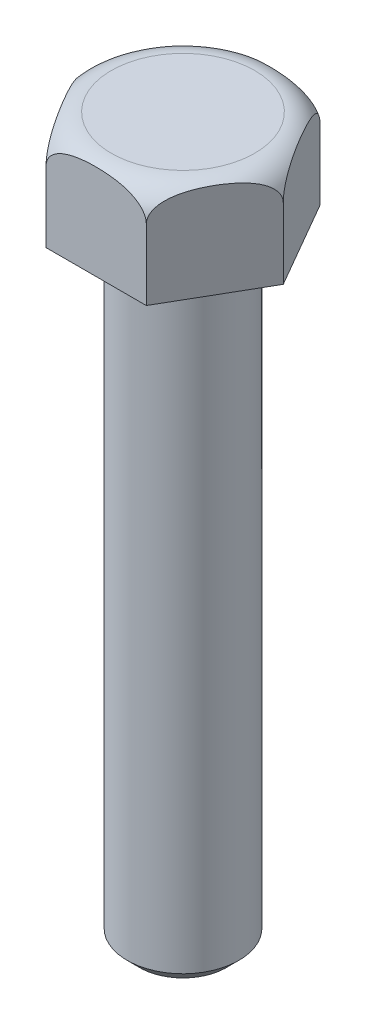
ISO-10303-21;
HEADER;
FILE_DESCRIPTION(('STEP AP214'),'2;1');
FILE_NAME('part.step','',(''),(''),'','','');
FILE_SCHEMA(('AUTOMOTIVE_DESIGN { 1 0 10303 214 1 1 1 1 }'));
ENDSEC;
DATA;
#1=APPLICATION_CONTEXT('core data for automotive mechanical design processes');
#2=APPLICATION_PROTOCOL_DEFINITION('international standard','automotive_design',2000,#1);
#3=PRODUCT_CONTEXT('',#1,'mechanical');
#4=PRODUCT('Part','Part','',(#3));
#5=PRODUCT_RELATED_PRODUCT_CATEGORY('part','',(#4));
#6=PRODUCT_DEFINITION_FORMATION('','',#4);
#7=PRODUCT_DEFINITION_CONTEXT('part definition',#1,'design');
#8=PRODUCT_DEFINITION('design','',#6,#7);
#9=PRODUCT_DEFINITION_SHAPE('','',#8);
#10=(LENGTH_UNIT() NAMED_UNIT(*) SI_UNIT(.MILLI.,.METRE.));
#11=(NAMED_UNIT(*) PLANE_ANGLE_UNIT() SI_UNIT($,.RADIAN.));
#12=(NAMED_UNIT(*) SI_UNIT($,.STERADIAN.) SOLID_ANGLE_UNIT());
#13=UNCERTAINTY_MEASURE_WITH_UNIT(LENGTH_MEASURE(1.E-05),#10,'distance_accuracy_value','');
#14=(GEOMETRIC_REPRESENTATION_CONTEXT(3) GLOBAL_UNCERTAINTY_ASSIGNED_CONTEXT((#13)) GLOBAL_UNIT_ASSIGNED_CONTEXT((#10,
#11,#12)) REPRESENTATION_CONTEXT('',''));
#15=CARTESIAN_POINT('',(0.,0.,0.));
#16=DIRECTION('',(0.,0.,1.));
#17=DIRECTION('',(1.,0.,0.));
#18=AXIS2_PLACEMENT_3D('',#15,#16,#17);
#19=CARTESIAN_POINT('',(2.02072594216373,4.,3.49999999999998));
#20=DIRECTION('',(-0.866025403784441,0.,-0.499999999999995));
#21=DIRECTION('',(-0.499999999999995,0.,0.866025403784442));
#22=AXIS2_PLACEMENT_3D('',#19,#20,#21);
#23=PLANE('',#22);
#24=DIRECTION('',(0.,-1.,0.));
#25=VECTOR('',#24,1.);
#26=CARTESIAN_POINT('',(4.04145188432738,4.,0.));
#27=LINE('',#26,#25);
#28=CARTESIAN_POINT('',(4.04145188432738,2.85,0.));
#29=VERTEX_POINT('',#28);
#30=CARTESIAN_POINT('',(4.04145188432738,0.,0.));
#31=VERTEX_POINT('',#30);
#32=EDGE_CURVE('E128',#29,#31,#27,.T.);
#33=ORIENTED_EDGE('',*,*,#32,.F.);
#34=CARTESIAN_POINT('',(4.04145186693608,2.8498,3.0122621691985E-08));
#35=CARTESIAN_POINT('',(4.04149322142417,2.88380187892288,-7.15979518764948E-05));
#36=CARTESIAN_POINT('',(4.03995806465525,2.91773436665771,0.00258737156948076));
#37=CARTESIAN_POINT('',(4.03403696877717,2.98433902225331,0.0128430104668064));
#38=CARTESIAN_POINT('',(4.02967241562956,3.01701871253889,0.020402638270793));
#39=CARTESIAN_POINT('',(4.01839956153353,3.08045895031124,0.039927794311432));
#40=CARTESIAN_POINT('',(4.01149698940557,3.11122363887679,0.0518833999399569));
#41=CARTESIAN_POINT('',(3.99555166649071,3.17048398695372,0.0795015093715882));
#42=CARTESIAN_POINT('',(3.98650487796236,3.19897522840241,0.0951710067480303));
#43=CARTESIAN_POINT('',(3.96128242026667,3.26824215864386,0.138857584968719));
#44=CARTESIAN_POINT('',(3.94390587637558,3.30726923766369,0.168954641848046));
#45=CARTESIAN_POINT('',(3.90629578057345,3.37935145497597,0.234097238654863));
#46=CARTESIAN_POINT('',(3.88605506551304,3.41239113161981,0.269155185521024));
#47=CARTESIAN_POINT('',(3.83064604955829,3.49165109931031,0.365126416352049));
#48=CARTESIAN_POINT('',(3.79393655609501,3.53352591788705,0.428709124150558));
#49=CARTESIAN_POINT('',(3.71792425190768,3.60602584385068,0.560366297003395));
#50=CARTESIAN_POINT('',(3.67861780313085,3.63663475715325,0.628447063349973));
#51=CARTESIAN_POINT('',(3.59815182063276,3.68944385343092,0.767818233317607));
#52=CARTESIAN_POINT('',(3.55697615149526,3.71154306479972,0.839136584299411));
#53=CARTESIAN_POINT('',(3.47383086822094,3.74883987788691,0.983148439340244));
#54=CARTESIAN_POINT('',(3.43186039734498,3.76402953184749,1.055843427315));
#55=CARTESIAN_POINT('',(3.34722305236247,3.78901681452749,1.20243960904243));
#56=CARTESIAN_POINT('',(3.30455333884125,3.79877476822347,1.27634572080561));
#57=CARTESIAN_POINT('',(3.21901012375083,3.81370913442472,1.42451091558501));
#58=CARTESIAN_POINT('',(3.17613656780916,3.81888424656301,1.49877009277713));
#59=CARTESIAN_POINT('',(3.06955021873615,3.8267520738256,1.68338306476486));
#60=CARTESIAN_POINT('',(3.00579215872111,3.82703190121715,1.79381526410293));
#61=CARTESIAN_POINT('',(2.87828362251635,3.81887355388723,2.01466652720832));
#62=CARTESIAN_POINT('',(2.81453335916186,3.81041995997919,2.12508522233419));
#63=CARTESIAN_POINT('',(2.71970154910687,3.7897270685824,2.28933873552316));
#64=CARTESIAN_POINT('',(2.6883961052263,3.78156160034086,2.3435613548778));
#65=CARTESIAN_POINT('',(2.62603002776021,3.7621286269075,2.45158256971785));
#66=CARTESIAN_POINT('',(2.59496932808908,3.75086199083149,2.50538127966688));
#67=CARTESIAN_POINT('',(2.53332579545366,3.72468659013026,2.61215101014945));
#68=CARTESIAN_POINT('',(2.50274180028232,3.70978895737025,2.66512404368466));
#69=CARTESIAN_POINT('',(2.44220353369672,3.67559863797259,2.76997939721308));
#70=CARTESIAN_POINT('',(2.41224883521509,3.65630904455528,2.82186245690867));
#71=CARTESIAN_POINT('',(2.35637386471924,3.61468453436952,2.91864074467889));
#72=CARTESIAN_POINT('',(2.33035742935453,3.59287312074561,2.9637025325624));
#73=CARTESIAN_POINT('',(2.27948604282456,3.54414446708189,3.05181435868379));
#74=CARTESIAN_POINT('',(2.25463252539055,3.51722112119256,3.09486191362628));
#75=CARTESIAN_POINT('',(2.20654584186762,3.45714160952322,3.17815049265549));
#76=CARTESIAN_POINT('',(2.18332885996643,3.42393267864201,3.21836348490675));
#77=CARTESIAN_POINT('',(2.13978500565841,3.35057373504828,3.29378365292563));
#78=CARTESIAN_POINT('',(2.11945305152026,3.31043621008252,3.32899963051006));
#79=CARTESIAN_POINT('',(2.089069633978,3.2370851957512,3.38162525340083));
#80=CARTESIAN_POINT('',(2.07782437118175,3.20585959787492,3.40110261990841));
#81=CARTESIAN_POINT('',(2.05793752835064,3.14033104450374,3.43554764209402));
#82=CARTESIAN_POINT('',(2.04928806210987,3.10603782935721,3.45052895708138));
#83=CARTESIAN_POINT('',(2.03531139585471,3.03560686955835,3.47473725315576));
#84=CARTESIAN_POINT('',(2.02991843405035,2.99952277105469,3.48407813700419));
#85=CARTESIAN_POINT('',(2.02444061050431,2.94419099021802,3.49356600570084));
#86=CARTESIAN_POINT('',(2.02304962792378,2.92543529463202,3.49597525820274));
#87=CARTESIAN_POINT('',(2.02118908251811,2.88772394417357,3.49919781737515));
#88=CARTESIAN_POINT('',(2.02072042407298,2.86876811134469,3.50000955761353));
#89=CARTESIAN_POINT('',(2.02072595955503,2.8498,3.49999996987736));
#90=B_SPLINE_CURVE_WITH_KNOTS('',3,(#34,#35,#36,#37,#38,#39,#40,#41,#42,#43,#44,#45,#46,#47,#48,
#49,#50,#51,#52,#53,#54,#55,#56,#57,#58,#59,#60,#61,#62,#63,#64,#65,#66,#67,#68,#69,#70,#71,#72,
#73,#74,#75,#76,#77,#78,#79,#80,#81,#82,#83,#84,#85,#86,#87,#88,#89),.UNSPECIFIED.,.F.,.F.,(4,2,
2,2,2,2,2,2,2,2,2,2,2,2,2,2,2,2,2,2,2,2,2,2,2,2,2,4),(0.,0.101754261353979,0.202748242949517,
0.303515646351419,0.404474332416497,0.560353276427938,0.716629192040826,0.968758852911432,
1.22124953303979,1.47665003919534,1.73234358295413,1.98988108277465,2.24749163466334,
2.62975496827881,3.01269435760164,3.20205766445746,3.39136795535976,3.58010500456721,
3.76870953682063,3.93774858454471,4.10699082253584,4.27772242837004,4.44814946923331,
4.56319948836864,4.67789635454159,4.79019200366945,4.84699357104923,4.90385080720723),.UNSPECIFIED.);
#91=CARTESIAN_POINT('',(2.02072594216373,2.85,3.49999999999998));
#92=VERTEX_POINT('',#91);
#93=EDGE_CURVE('E110',#29,#92,#90,.T.);
#94=ORIENTED_EDGE('',*,*,#93,.T.);
#95=DIRECTION('',(0.,-1.,0.));
#96=VECTOR('',#95,1.);
#97=CARTESIAN_POINT('',(2.02072594216373,4.,3.49999999999998));
#98=LINE('',#97,#96);
#99=CARTESIAN_POINT('',(2.02072594216373,0.,3.49999999999998));
#100=VERTEX_POINT('',#99);
#101=EDGE_CURVE('E75',#92,#100,#98,.T.);
#102=ORIENTED_EDGE('',*,*,#101,.T.);
#103=DIRECTION('',(0.499999999999995,0.,-0.866025403784441));
#104=VECTOR('',#103,1.);
#105=CARTESIAN_POINT('',(2.02072594216373,0.,3.49999999999998));
#106=LINE('',#105,#104);
#107=EDGE_CURVE('E149',#100,#31,#106,.T.);
#108=ORIENTED_EDGE('',*,*,#107,.T.);
#109=EDGE_LOOP('',(#33,#94,#102,#108));
#110=FACE_BOUND('',#109,.T.);
#111=ADVANCED_FACE('F51',(#110),#23,.F.);
#112=CARTESIAN_POINT('',(4.04145188432738,4.,0.));
#113=DIRECTION('',(-0.866025403784438,0.,0.500000000000001));
#114=DIRECTION('',(0.500000000000001,0.,0.866025403784438));
#115=AXIS2_PLACEMENT_3D('',#112,#113,#114);
#116=PLANE('',#115);
#117=DIRECTION('',(0.,-1.,0.));
#118=VECTOR('',#117,1.);
#119=CARTESIAN_POINT('',(2.02072594216368,4.,-3.50000000000001));
#120=LINE('',#119,#118);
#121=CARTESIAN_POINT('',(2.02072594216368,2.85,-3.50000000000001));
#122=VERTEX_POINT('',#121);
#123=CARTESIAN_POINT('',(2.02072594216368,0.,-3.50000000000001));
#124=VERTEX_POINT('',#123);
#125=EDGE_CURVE('E119',#122,#124,#120,.T.);
#126=ORIENTED_EDGE('',*,*,#125,.F.);
#127=CARTESIAN_POINT('',(2.02072595955499,2.8498,-3.49999996987738));
#128=CARTESIAN_POINT('',(2.02068460506689,2.88380187892288,-3.50007159795188));
#129=CARTESIAN_POINT('',(2.02221976183582,2.91773436665771,-3.49741262843053));
#130=CARTESIAN_POINT('',(2.0281408577139,2.9843390222533,-3.4871569895332));
#131=CARTESIAN_POINT('',(2.0325054108615,3.01701871253889,-3.47959736172921));
#132=CARTESIAN_POINT('',(2.04377826495754,3.08045895031125,-3.46007220568857));
#133=CARTESIAN_POINT('',(2.05068083708549,3.11122363887679,-3.44811660006005));
#134=CARTESIAN_POINT('',(2.06662616000035,3.17048398695372,-3.42049849062842));
#135=CARTESIAN_POINT('',(2.07567294852871,3.19897522840242,-3.40482899325198));
#136=CARTESIAN_POINT('',(2.1008954062244,3.26824215864386,-3.36114241503129));
#137=CARTESIAN_POINT('',(2.11827195011549,3.30726923766369,-3.33104535815196));
#138=CARTESIAN_POINT('',(2.15588204591762,3.37935145497597,-3.26590276134514));
#139=CARTESIAN_POINT('',(2.17612276097803,3.41239113161981,-3.23084481447898));
#140=CARTESIAN_POINT('',(2.23153177693278,3.49165109931031,-3.13487358364796));
#141=CARTESIAN_POINT('',(2.26824127039606,3.53352591788705,-3.07129087584945));
#142=CARTESIAN_POINT('',(2.34425357458339,3.60602584385068,-2.93963370299661));
#143=CARTESIAN_POINT('',(2.38356002336022,3.63663475715326,-2.87155293665004));
#144=CARTESIAN_POINT('',(2.46402600585831,3.68944385343092,-2.7321817666824));
#145=CARTESIAN_POINT('',(2.50520167499581,3.71154306479972,-2.6608634157006));
#146=CARTESIAN_POINT('',(2.58834695827013,3.74883987788692,-2.51685156065977));
#147=CARTESIAN_POINT('',(2.63031742914609,3.76402953184749,-2.44415657268501));
#148=CARTESIAN_POINT('',(2.7149547741286,3.78901681452749,-2.29756039095758));
#149=CARTESIAN_POINT('',(2.75762448764983,3.79877476822348,-2.2236542791944));
#150=CARTESIAN_POINT('',(2.84316770274025,3.81370913442473,-2.075489084415));
#151=CARTESIAN_POINT('',(2.88604125868191,3.81888424656302,-2.00122990722289));
#152=CARTESIAN_POINT('',(2.99262760775493,3.82675207382561,-1.81661693523515));
#153=CARTESIAN_POINT('',(3.05638566776997,3.82703190121716,-1.70618473589708));
#154=CARTESIAN_POINT('',(3.18389420397474,3.81887355388724,-1.48533347279168));
#155=CARTESIAN_POINT('',(3.24764446732924,3.8104199599792,-1.3749147776658));
#156=CARTESIAN_POINT('',(3.34247627738423,3.78972706858241,-1.21066126447683));
#157=CARTESIAN_POINT('',(3.3737817212648,3.78156160034087,-1.15643864512218));
#158=CARTESIAN_POINT('',(3.43614779873089,3.76212862690751,-1.04841743028214));
#159=CARTESIAN_POINT('',(3.46720849840203,3.7508619908315,-0.9946187203331));
#160=CARTESIAN_POINT('',(3.52885203103745,3.72468659013026,-0.887848989850522));
#161=CARTESIAN_POINT('',(3.55943602620879,3.70978895737025,-0.834875956315315));
#162=CARTESIAN_POINT('',(3.6199742927944,3.67559863797259,-0.730020602786891));
#163=CARTESIAN_POINT('',(3.64992899127603,3.65630904455528,-0.6781375430913));
#164=CARTESIAN_POINT('',(3.70580396177188,3.61468453436952,-0.581359255321073));
#165=CARTESIAN_POINT('',(3.73182039713659,3.59287312074561,-0.536297467437568));
#166=CARTESIAN_POINT('',(3.78269178366656,3.54414446708189,-0.448185641316179));
#167=CARTESIAN_POINT('',(3.80754530110056,3.51722112119256,-0.405138086373692));
#168=CARTESIAN_POINT('',(3.8556319846235,3.45714160952321,-0.321849507344479));
#169=CARTESIAN_POINT('',(3.87884896652468,3.42393267864201,-0.281636515093218));
#170=CARTESIAN_POINT('',(3.92239282083271,3.35057373504827,-0.20621634707434));
#171=CARTESIAN_POINT('',(3.94272477497085,3.31043621008252,-0.171000369489917));
#172=CARTESIAN_POINT('',(3.97310819251311,3.23708519575119,-0.118374746599144));
#173=CARTESIAN_POINT('',(3.98435345530937,3.20585959787491,-0.098897380091565));
#174=CARTESIAN_POINT('',(4.00424029814047,3.14033104450374,-0.0644523579059571));
#175=CARTESIAN_POINT('',(4.01288976438124,3.1060378293572,-0.0494710429185909));
#176=CARTESIAN_POINT('',(4.02686643063641,3.03560686955835,-0.0252627468442127));
#177=CARTESIAN_POINT('',(4.03225939244076,2.99952277105468,-0.0159218629957916));
#178=CARTESIAN_POINT('',(4.03773721598681,2.94419099021802,-0.00643399429914256));
#179=CARTESIAN_POINT('',(4.03912819856733,2.92543529463201,-0.00402474179723443));
#180=CARTESIAN_POINT('',(4.040988743973,2.88772394417357,-0.000802182624827273));
#181=CARTESIAN_POINT('',(4.04145740241814,2.86876811134469,9.55761354566829E-06));
#182=CARTESIAN_POINT('',(4.04145186693608,2.8498,-3.0122621522535E-08));
#183=B_SPLINE_CURVE_WITH_KNOTS('',3,(#127,#128,#129,#130,#131,#132,#133,#134,#135,#136,#137,
#138,#139,#140,#141,#142,#143,#144,#145,#146,#147,#148,#149,#150,#151,#152,#153,#154,#155,#156,
#157,#158,#159,#160,#161,#162,#163,#164,#165,#166,#167,#168,#169,#170,#171,#172,#173,#174,#175,
#176,#177,#178,#179,#180,#181,#182),.UNSPECIFIED.,.F.,.F.,(4,2,2,2,2,2,2,2,2,2,2,2,2,2,2,2,2,2,
2,2,2,2,2,2,2,2,2,4),(0.,0.101754261353979,0.202748242949519,0.303515646351422,
0.404474332416501,0.560353276427943,0.71662919204083,0.968758852911437,1.22124953303979,
1.47665003919534,1.73234358295413,1.98988108277465,2.24749163466334,2.62975496827883,
3.01269435760168,3.20205766445751,3.39136795535981,3.58010500456727,3.7687095368207,
3.93774858454478,4.10699082253591,4.27772242837011,4.44814946923338,4.56319948836871,
4.67789635454166,4.79019200366951,4.84699357104929,4.90385080720729),.UNSPECIFIED.);
#184=EDGE_CURVE('E105',#122,#29,#183,.T.);
#185=ORIENTED_EDGE('',*,*,#184,.T.);
#186=ORIENTED_EDGE('',*,*,#32,.T.);
#187=DIRECTION('',(-0.500000000000001,0.,-0.866025403784438));
#188=VECTOR('',#187,1.);
#189=CARTESIAN_POINT('',(4.04145188432738,0.,0.));
#190=LINE('',#189,#188);
#191=EDGE_CURVE('E126',#31,#124,#190,.T.);
#192=ORIENTED_EDGE('',*,*,#191,.T.);
#193=EDGE_LOOP('',(#126,#185,#186,#192));
#194=FACE_BOUND('',#193,.T.);
#195=ADVANCED_FACE('F124',(#194),#116,.F.);
#196=CARTESIAN_POINT('',(2.02072594216368,4.,-3.50000000000001));
#197=DIRECTION('',(0.,0.,1.));
#198=DIRECTION('',(1.,0.,0.));
#199=AXIS2_PLACEMENT_3D('',#196,#197,#198);
#200=PLANE('',#199);
#201=DIRECTION('',(0.,-1.,0.));
#202=VECTOR('',#201,1.);
#203=CARTESIAN_POINT('',(-2.02072594216371,4.,-3.49999999999999));
#204=LINE('',#203,#202);
#205=CARTESIAN_POINT('',(-2.02072594216371,2.85,-3.49999999999999));
#206=VERTEX_POINT('',#205);
#207=CARTESIAN_POINT('',(-2.02072594216371,0.,-3.49999999999999));
#208=VERTEX_POINT('',#207);
#209=EDGE_CURVE('E121',#206,#208,#204,.T.);
#210=ORIENTED_EDGE('',*,*,#209,.F.);
#211=CARTESIAN_POINT('',(0.,3.8257915714492,-3.5));
#212=CARTESIAN_POINT('',(0.0968747541180367,3.82579401779786,-3.5));
#213=CARTESIAN_POINT('',(0.193753331968984,3.82331184079732,-3.5));
#214=CARTESIAN_POINT('',(0.387304141422879,3.81304925554672,-3.5));
#215=CARTESIAN_POINT('',(0.483976197472347,3.80526539657535,-3.5));
#216=CARTESIAN_POINT('',(0.676595983454664,3.78336949230768,-3.5));
#217=CARTESIAN_POINT('',(0.772543946428783,3.76925957974779,-3.5));
#218=CARTESIAN_POINT('',(0.962843912436279,3.73294906986294,-3.5));
#219=CARTESIAN_POINT('',(1.05719791821997,3.71075956112637,-3.5));
#220=CARTESIAN_POINT('',(1.23575396719194,3.65774125495074,-3.5));
#221=CARTESIAN_POINT('',(1.32018278922404,3.6276965831677,-3.5));
#222=CARTESIAN_POINT('',(1.48370166241351,3.5556250356562,-3.5));
#223=CARTESIAN_POINT('',(1.56281247186393,3.51364855247938,-3.5));
#224=CARTESIAN_POINT('',(1.6771256980705,3.43694228107069,-3.50000000000001));
#225=CARTESIAN_POINT('',(1.71592836236664,3.40760559979716,-3.50000000000001));
#226=CARTESIAN_POINT('',(1.7891533086168,3.3438161282159,-3.50000000000001));
#227=CARTESIAN_POINT('',(1.82357797361086,3.30936614351359,-3.50000000000001));
#228=CARTESIAN_POINT('',(1.88067799301399,3.24162966185989,-3.50000000000001));
#229=CARTESIAN_POINT('',(1.90435519755799,3.2091954458428,-3.50000000000001));
#230=CARTESIAN_POINT('',(1.94610500517172,3.14088798404083,-3.50000000000001));
#231=CARTESIAN_POINT('',(1.96418545430117,3.10501964580604,-3.50000000000001));
#232=CARTESIAN_POINT('',(1.99099897180636,3.03659874797636,-3.50000000000001));
#233=CARTESIAN_POINT('',(2.00077453049326,3.00445687863608,-3.50000000000001));
#234=CARTESIAN_POINT('',(2.01477635063669,2.93898100504087,-3.50000000000001));
#235=CARTESIAN_POINT('',(2.01900555436506,2.90564764250734,-3.50000000000001));
#236=CARTESIAN_POINT('',(2.02159145349128,2.83869061190515,-3.50000000000001));
#237=CARTESIAN_POINT('',(2.01993753440324,2.80506652841199,-3.50000000000001));
#238=CARTESIAN_POINT('',(2.01086648396055,2.7386081755057,-3.50000000000001));
#239=CARTESIAN_POINT('',(2.00344770231587,2.70577413503112,-3.50000000000001));
#240=CARTESIAN_POINT('',(1.98358242351281,2.64236903640547,-3.50000000000001));
#241=CARTESIAN_POINT('',(1.97123325350463,2.61176700343144,-3.50000000000001));
#242=CARTESIAN_POINT('',(1.94224918773484,2.5526861056435,-3.50000000000001));
#243=CARTESIAN_POINT('',(1.9256126594174,2.52420805494526,-3.50000000000001));
#244=CARTESIAN_POINT('',(1.87935239940166,2.45559838348947,-3.50000000000001));
#245=CARTESIAN_POINT('',(1.84744908186895,2.41700289422043,-3.50000000000001));
#246=CARTESIAN_POINT('',(1.77792403735215,2.34536252340815,-3.50000000000001));
#247=CARTESIAN_POINT('',(1.7402879459174,2.31233203649333,-3.50000000000001));
#248=CARTESIAN_POINT('',(1.63811433290068,2.23373512156779,-3.50000000000001));
#249=CARTESIAN_POINT('',(1.57063961110917,2.19201676016642,-3.5));
#250=CARTESIAN_POINT('',(1.4303530504514,2.1190425434126,-3.5));
#251=CARTESIAN_POINT('',(1.35753061948084,2.08780817407609,-3.5));
#252=CARTESIAN_POINT('',(1.21017984959387,2.03406624331419,-3.5));
#253=CARTESIAN_POINT('',(1.13570011381741,2.01142201753246,-3.5));
#254=CARTESIAN_POINT('',(0.98507308111634,1.9724489313246,-3.5));
#255=CARTESIAN_POINT('',(0.908924101313715,1.95612678619733,-3.5));
#256=CARTESIAN_POINT('',(0.755480340374856,1.92850848761449,-3.5));
#257=CARTESIAN_POINT('',(0.678182573151261,1.91722937247032,-3.5));
#258=CARTESIAN_POINT('',(0.523084565992925,1.89885888079574,-3.5));
#259=CARTESIAN_POINT('',(0.44528418521893,1.89176873454116,-3.5));
#260=CARTESIAN_POINT('',(0.257442833523645,1.87898416670313,-3.5));
#261=CARTESIAN_POINT('',(0.147281290102371,1.87505837120501,-3.5));
#262=CARTESIAN_POINT('',(-0.073150362833975,1.87360333308778,-3.5));
#263=CARTESIAN_POINT('',(-0.183420493949186,1.87607862720923,-3.5));
#264=CARTESIAN_POINT('',(-0.403474970107744,1.88787146204599,-3.5));
#265=CARTESIAN_POINT('',(-0.513259768624072,1.897179810933,-3.5));
#266=CARTESIAN_POINT('',(-0.731692796179259,1.92419704409934,-3.5));
#267=CARTESIAN_POINT('',(-0.84034222247041,1.94189591662703,-3.5));
#268=CARTESIAN_POINT('',(-1.0560668038706,1.98870552405946,-3.5));
#269=CARTESIAN_POINT('',(-1.1631284948693,2.0178845091465,-3.5));
#270=CARTESIAN_POINT('',(-1.31926665013749,2.07347036533331,-3.5));
#271=CARTESIAN_POINT('',(-1.37045883490234,2.09390871297873,-3.49999999999999));
#272=CARTESIAN_POINT('',(-1.47070253216456,2.13944830779356,-3.49999999999999));
#273=CARTESIAN_POINT('',(-1.51975638190978,2.16454429778892,-3.49999999999999));
#274=CARTESIAN_POINT('',(-1.60952386391564,2.21717481666155,-3.49999999999999));
#275=CARTESIAN_POINT('',(-1.65056389881863,2.24414580900185,-3.49999999999999));
#276=CARTESIAN_POINT('',(-1.72905464465549,2.30306191186374,-3.49999999999999));
#277=CARTESIAN_POINT('',(-1.76650085269541,2.33501313423497,-3.49999999999999));
#278=CARTESIAN_POINT('',(-1.83656555507215,2.40475773436823,-3.49999999999999));
#279=CARTESIAN_POINT('',(-1.86911645093938,2.4426203688232,-3.49999999999999));
#280=CARTESIAN_POINT('',(-1.92642064216082,2.52384368779254,-3.49999999999999));
#281=CARTESIAN_POINT('',(-1.95119846410851,2.56718646071882,-3.49999999999999));
#282=CARTESIAN_POINT('',(-1.98409183169029,2.64371586513253,-3.49999999999999));
#283=CARTESIAN_POINT('',(-1.99500246392012,2.67570510837032,-3.49999999999999));
#284=CARTESIAN_POINT('',(-2.01132351541708,2.74106485422982,-3.49999999999999));
#285=CARTESIAN_POINT('',(-2.01673759090961,2.77443442328283,-3.49999999999999));
#286=CARTESIAN_POINT('',(-2.02165431789779,2.84169893568551,-3.49999999999999));
#287=CARTESIAN_POINT('',(-2.02114159319053,2.8755950176462,-3.49999999999999));
#288=CARTESIAN_POINT('',(-2.01421077952181,2.94277580479482,-3.49999999999999));
#289=CARTESIAN_POINT('',(-2.00779139609898,2.97606037433711,-3.49999999999999));
#290=CARTESIAN_POINT('',(-1.98982041134408,3.04008084717045,-3.49999999999999));
#291=CARTESIAN_POINT('',(-1.97843320697703,3.07086369543011,-3.49999999999999));
#292=CARTESIAN_POINT('',(-1.95127242747696,3.1304107039284,-3.49999999999999));
#293=CARTESIAN_POINT('',(-1.93549703216592,3.15917402027142,-3.49999999999999));
#294=CARTESIAN_POINT('',(-1.89188203902411,3.22760288176327,-3.49999999999999));
#295=CARTESIAN_POINT('',(-1.86188296217398,3.26589246818482,-3.49999999999999));
#296=CARTESIAN_POINT('',(-1.79617450560066,3.33719655151869,-3.49999999999999));
#297=CARTESIAN_POINT('',(-1.7604522429868,3.370198803264,-3.49999999999999));
#298=CARTESIAN_POINT('',(-1.66399598989646,3.4482899265468,-3.49999999999999));
#299=CARTESIAN_POINT('',(-1.6004264699434,3.48985010419423,-3.49999999999999));
#300=CARTESIAN_POINT('',(-1.46784770814743,3.5630431360353,-3.49999999999999));
#301=CARTESIAN_POINT('',(-1.39882445952961,3.59464931552967,-3.49999999999999));
#302=CARTESIAN_POINT('',(-1.26024290710006,3.64889772518409,-3.49999999999999));
#303=CARTESIAN_POINT('',(-1.19079124805931,3.67181916269831,-3.5));
#304=CARTESIAN_POINT('',(-1.05017116026943,3.71172907488603,-3.5));
#305=CARTESIAN_POINT('',(-0.979001022723388,3.72871136028551,-3.5));
#306=CARTESIAN_POINT('',(-0.835645002142026,3.75787753561749,-3.5));
#307=CARTESIAN_POINT('',(-0.763458308819113,3.77005734368297,-3.5));
#308=CARTESIAN_POINT('',(-0.618573182674664,3.79045261663592,-3.5));
#309=CARTESIAN_POINT('',(-0.545874983085491,3.79866978281615,-3.5));
#310=CARTESIAN_POINT('',(-0.394399785255758,3.81227142625576,-3.5));
#311=CARTESIAN_POINT('',(-0.3155984277899,3.81737919784485,-3.5));
#312=CARTESIAN_POINT('',(-0.157865546179698,3.82413802520395,-3.5));
#313=CARTESIAN_POINT('',(-0.0789340423920021,3.82578957815188,-3.5));
#314=CARTESIAN_POINT('',(0.,3.8257915714492,-3.5));
#315=B_SPLINE_CURVE_WITH_KNOTS('',3,(#211,#212,#213,#214,#215,#216,#217,#218,#219,#220,#221,
#222,#223,#224,#225,#226,#227,#228,#229,#230,#231,#232,#233,#234,#235,#236,#237,#238,#239,#240,
#241,#242,#243,#244,#245,#246,#247,#248,#249,#250,#251,#252,#253,#254,#255,#256,#257,#258,#259,
#260,#261,#262,#263,#264,#265,#266,#267,#268,#269,#270,#271,#272,#273,#274,#275,#276,#277,#278,
#279,#280,#281,#282,#283,#284,#285,#286,#287,#288,#289,#290,#291,#292,#293,#294,#295,#296,#297,
#298,#299,#300,#301,#302,#303,#304,#305,#306,#307,#308,#309,#310,#311,#312,#313,#314),
.UNSPECIFIED.,.T.,.F.,(4,2,2,2,2,2,2,2,2,2,2,2,2,2,2,2,2,2,2,2,2,2,2,2,2,2,2,2,2,2,2,2,2,2,2,2,
2,2,2,2,2,2,2,2,2,2,2,2,2,2,2,4),(0.,0.290596866071085,0.581383054749934,0.87207128275176,
1.16236205930142,1.43060588800533,1.69773323813915,1.84331616188637,1.98881949939597,
2.10884826251437,2.22870798785404,2.32905669532736,2.42935214750607,2.52982864710618,
2.63033392041547,2.72894620981352,2.82759610478297,2.97696480362282,3.12671412265887,
3.36336134538647,3.60049063600595,3.83367104911372,4.06709847107181,4.30130869598468,
4.53558767293042,4.86606799313007,5.19678260380338,5.52705315038883,5.85693059922882,
6.18879957157875,6.35398396368585,6.51898303043674,6.6660061635439,6.81321116833004,
6.96229196186227,7.11089751196757,7.21187286628754,7.31278100925207,7.41395100203681,
7.51514317180052,7.6132143214692,7.71132621089164,7.85642569504981,8.0018565097254,
8.22842193354745,8.45558943994678,8.67466480296998,8.89396779194216,9.11345677781747,
9.33285144575641,9.5696653183787,9.80644512292389),.UNSPECIFIED.);
#316=EDGE_CURVE('E108',#206,#122,#315,.T.);
#317=ORIENTED_EDGE('',*,*,#316,.T.);
#318=ORIENTED_EDGE('',*,*,#125,.T.);
#319=DIRECTION('',(-1.,0.,0.));
#320=VECTOR('',#319,1.);
#321=CARTESIAN_POINT('',(2.02072594216368,0.,-3.50000000000001));
#322=LINE('',#321,#320);
#323=EDGE_CURVE('E152',#124,#208,#322,.T.);
#324=ORIENTED_EDGE('',*,*,#323,.T.);
#325=EDGE_LOOP('',(#210,#317,#318,#324));
#326=FACE_BOUND('',#325,.T.);
#327=ADVANCED_FACE('F117',(#326),#200,.F.);
#328=CARTESIAN_POINT('',(-2.02072594216371,4.,-3.49999999999999));
#329=DIRECTION('',(0.866025403784442,0.,0.499999999999995));
#330=DIRECTION('',(0.499999999999995,0.,-0.866025403784442));
#331=AXIS2_PLACEMENT_3D('',#328,#329,#330);
#332=PLANE('',#331);
#333=DIRECTION('',(0.,-1.,0.));
#334=VECTOR('',#333,1.);
#335=CARTESIAN_POINT('',(-4.04145188432738,4.,0.));
#336=LINE('',#335,#334);
#337=CARTESIAN_POINT('',(-4.04145188432738,2.85,0.));
#338=VERTEX_POINT('',#337);
#339=CARTESIAN_POINT('',(-4.04145188432738,0.,0.));
#340=VERTEX_POINT('',#339);
#341=EDGE_CURVE('E132',#338,#340,#336,.T.);
#342=ORIENTED_EDGE('',*,*,#341,.F.);
#343=CARTESIAN_POINT('',(-4.04145186693608,2.8498,-3.01225944352804E-08));
#344=CARTESIAN_POINT('',(-4.04149322142417,2.88380187892288,7.15979519046825E-05));
#345=CARTESIAN_POINT('',(-4.03995806465525,2.91773436665771,-0.00258737156945265));
#346=CARTESIAN_POINT('',(-4.03403696877717,2.98433902225331,-0.0128430104667789));
#347=CARTESIAN_POINT('',(-4.02967241562956,3.01701871253889,-0.020402638270766));
#348=CARTESIAN_POINT('',(-4.01839956153353,3.08045895031125,-0.039927794311405));
#349=CARTESIAN_POINT('',(-4.01149698940558,3.11122363887679,-0.0518833999399293));
#350=CARTESIAN_POINT('',(-3.99555166649071,3.17048398695372,-0.0795015093715612));
#351=CARTESIAN_POINT('',(-3.98650487796236,3.19897522840242,-0.0951710067480047));
#352=CARTESIAN_POINT('',(-3.96128242026667,3.26824215864387,-0.138857584968695));
#353=CARTESIAN_POINT('',(-3.94390587637558,3.30726923766369,-0.168954641848021));
#354=CARTESIAN_POINT('',(-3.90629578057345,3.37935145497598,-0.234097238654838));
#355=CARTESIAN_POINT('',(-3.88605506551304,3.41239113161981,-0.269155185520999));
#356=CARTESIAN_POINT('',(-3.83064604955828,3.49165109931032,-0.365126416352025));
#357=CARTESIAN_POINT('',(-3.79393655609501,3.53352591788705,-0.428709124150535));
#358=CARTESIAN_POINT('',(-3.71792425190768,3.60602584385068,-0.560366297003372));
#359=CARTESIAN_POINT('',(-3.67861780313085,3.63663475715326,-0.628447063349951));
#360=CARTESIAN_POINT('',(-3.59815182063276,3.68944385343093,-0.767818233317586));
#361=CARTESIAN_POINT('',(-3.55697615149526,3.71154306479972,-0.839136584299391));
#362=CARTESIAN_POINT('',(-3.47383086822094,3.74883987788692,-0.983148439340224));
#363=CARTESIAN_POINT('',(-3.43186039734497,3.76402953184749,-1.05584342731498));
#364=CARTESIAN_POINT('',(-3.34722305236247,3.78901681452749,-1.20243960904242));
#365=CARTESIAN_POINT('',(-3.30455333884124,3.79877476822348,-1.27634572080559));
#366=CARTESIAN_POINT('',(-3.21901012375082,3.81370913442473,-1.424510915585));
#367=CARTESIAN_POINT('',(-3.17613656780915,3.81888424656302,-1.49877009277711));
#368=CARTESIAN_POINT('',(-3.06955021873614,3.82675207382561,-1.68338306476484));
#369=CARTESIAN_POINT('',(-3.0057921587211,3.82703190121716,-1.79381526410292));
#370=CARTESIAN_POINT('',(-2.87828362251633,3.81887355388724,-2.01466652720832));
#371=CARTESIAN_POINT('',(-2.81453335916184,3.8104199599792,-2.12508522233419));
#372=CARTESIAN_POINT('',(-2.71970154910685,3.78972706858241,-2.28933873552316));
#373=CARTESIAN_POINT('',(-2.68839610522628,3.78156160034087,-2.34356135487781));
#374=CARTESIAN_POINT('',(-2.62603002776019,3.76212862690751,-2.45158256971785));
#375=CARTESIAN_POINT('',(-2.59496932808906,3.7508619908315,-2.50538127966689));
#376=CARTESIAN_POINT('',(-2.53332579545364,3.72468659013026,-2.61215101014947));
#377=CARTESIAN_POINT('',(-2.5027418002823,3.70978895737025,-2.66512404368467));
#378=CARTESIAN_POINT('',(-2.44220353369669,3.67559863797259,-2.7699793972131));
#379=CARTESIAN_POINT('',(-2.41224883521506,3.65630904455528,-2.82186245690869));
#380=CARTESIAN_POINT('',(-2.35637386471921,3.61468453436952,-2.91864074467891));
#381=CARTESIAN_POINT('',(-2.3303574293545,3.59287312074561,-2.96370253256242));
#382=CARTESIAN_POINT('',(-2.27948604282453,3.54414446708189,-3.05181435868381));
#383=CARTESIAN_POINT('',(-2.25463252539053,3.51722112119256,-3.0948619136263));
#384=CARTESIAN_POINT('',(-2.20654584186759,3.45714160952322,-3.17815049265551));
#385=CARTESIAN_POINT('',(-2.18332885996641,3.42393267864201,-3.21836348490677));
#386=CARTESIAN_POINT('',(-2.13978500565838,3.35057373504828,-3.29378365292565));
#387=CARTESIAN_POINT('',(-2.11945305152024,3.31043621008252,-3.32899963051007));
#388=CARTESIAN_POINT('',(-2.08906963397798,3.2370851957512,-3.38162525340085));
#389=CARTESIAN_POINT('',(-2.07782437118172,3.20585959787492,-3.40110261990843));
#390=CARTESIAN_POINT('',(-2.05793752835062,3.14033104450374,-3.43554764209403));
#391=CARTESIAN_POINT('',(-2.04928806210985,3.10603782935721,-3.4505289570814));
#392=CARTESIAN_POINT('',(-2.03531139585468,3.03560686955835,-3.47473725315578));
#393=CARTESIAN_POINT('',(-2.02991843405033,2.99952277105468,-3.4840781370042));
#394=CARTESIAN_POINT('',(-2.02444061050428,2.94419099021802,-3.49356600570085));
#395=CARTESIAN_POINT('',(-2.02304962792376,2.92543529463201,-3.49597525820276));
#396=CARTESIAN_POINT('',(-2.02118908251809,2.88772394417357,-3.49919781737517));
#397=CARTESIAN_POINT('',(-2.02072042407295,2.86876811134469,-3.50000955761354));
#398=CARTESIAN_POINT('',(-2.02072595955501,2.8498,-3.49999996987737));
#399=B_SPLINE_CURVE_WITH_KNOTS('',3,(#343,#344,#345,#346,#347,#348,#349,#350,#351,#352,#353,
#354,#355,#356,#357,#358,#359,#360,#361,#362,#363,#364,#365,#366,#367,#368,#369,#370,#371,#372,
#373,#374,#375,#376,#377,#378,#379,#380,#381,#382,#383,#384,#385,#386,#387,#388,#389,#390,#391,
#392,#393,#394,#395,#396,#397,#398),.UNSPECIFIED.,.F.,.F.,(4,2,2,2,2,2,2,2,2,2,2,2,2,2,2,2,2,2,
2,2,2,2,2,2,2,2,2,4),(0.,0.10175426135398,0.20274824294952,0.303515646351423,0.404474332416503,
0.560353276427944,0.716629192040833,0.968758852911441,1.2212495330398,1.47665003919535,
1.73234358295414,1.98988108277466,2.24749163466336,2.62975496827884,3.01269435760168,
3.20205766445751,3.39136795535981,3.58010500456726,3.76870953682069,3.93774858454478,
4.1069908225359,4.2777224283701,4.44814946923337,4.56319948836871,4.67789635454165,
4.79019200366951,4.84699357104928,4.90385080720729),.UNSPECIFIED.);
#400=EDGE_CURVE('E122',#338,#206,#399,.T.);
#401=ORIENTED_EDGE('',*,*,#400,.T.);
#402=ORIENTED_EDGE('',*,*,#209,.T.);
#403=DIRECTION('',(-0.499999999999995,0.,0.866025403784441));
#404=VECTOR('',#403,1.);
#405=CARTESIAN_POINT('',(-2.02072594216371,0.,-3.49999999999999));
#406=LINE('',#405,#404);
#407=EDGE_CURVE('E154',#208,#340,#406,.T.);
#408=ORIENTED_EDGE('',*,*,#407,.T.);
#409=EDGE_LOOP('',(#342,#401,#402,#408));
#410=FACE_BOUND('',#409,.T.);
#411=ADVANCED_FACE('F172',(#410),#332,.F.);
#412=CARTESIAN_POINT('',(-4.04145188432738,4.,0.));
#413=DIRECTION('',(0.866025403784434,0.,-0.500000000000007));
#414=DIRECTION('',(-0.500000000000007,0.,-0.866025403784434));
#415=AXIS2_PLACEMENT_3D('',#412,#413,#414);
#416=PLANE('',#415);
#417=DIRECTION('',(0.,-1.,0.));
#418=VECTOR('',#417,1.);
#419=CARTESIAN_POINT('',(-2.02072594216366,4.,3.50000000000002));
#420=LINE('',#419,#418);
#421=CARTESIAN_POINT('',(-2.02072594216366,2.85,3.50000000000002));
#422=VERTEX_POINT('',#421);
#423=CARTESIAN_POINT('',(-2.02072594216366,0.,3.50000000000002));
#424=VERTEX_POINT('',#423);
#425=EDGE_CURVE('E163',#422,#424,#420,.T.);
#426=ORIENTED_EDGE('',*,*,#425,.F.);
#427=CARTESIAN_POINT('',(-2.02072595955496,2.8498,3.4999999698774));
#428=CARTESIAN_POINT('',(-2.02068460506687,2.88380187892288,3.5000715979519));
#429=CARTESIAN_POINT('',(-2.02221976183579,2.91773436665771,3.49741262843054));
#430=CARTESIAN_POINT('',(-2.02814085771387,2.98433902225331,3.48715698953321));
#431=CARTESIAN_POINT('',(-2.03250541086148,3.01701871253889,3.47959736172923));
#432=CARTESIAN_POINT('',(-2.04377826495751,3.08045895031125,3.46007220568859));
#433=CARTESIAN_POINT('',(-2.05068083708546,3.11122363887679,3.44811660006006));
#434=CARTESIAN_POINT('',(-2.06662616000033,3.17048398695372,3.42049849062843));
#435=CARTESIAN_POINT('',(-2.07567294852868,3.19897522840242,3.40482899325199));
#436=CARTESIAN_POINT('',(-2.10089540622437,3.26824215864386,3.3611424150313));
#437=CARTESIAN_POINT('',(-2.11827195011547,3.30726923766369,3.33104535815198));
#438=CARTESIAN_POINT('',(-2.15588204591759,3.37935145497597,3.26590276134516));
#439=CARTESIAN_POINT('',(-2.17612276097801,3.41239113161981,3.230844814479));
#440=CARTESIAN_POINT('',(-2.23153177693276,3.49165109931032,3.13487358364797));
#441=CARTESIAN_POINT('',(-2.26824127039603,3.53352591788705,3.07129087584947));
#442=CARTESIAN_POINT('',(-2.34425357458337,3.60602584385068,2.93963370299663));
#443=CARTESIAN_POINT('',(-2.3835600233602,3.63663475715326,2.87155293665005));
#444=CARTESIAN_POINT('',(-2.46402600585829,3.68944385343093,2.73218176668242));
#445=CARTESIAN_POINT('',(-2.50520167499579,3.71154306479972,2.66086341570061));
#446=CARTESIAN_POINT('',(-2.58834695827012,3.74883987788692,2.51685156065978));
#447=CARTESIAN_POINT('',(-2.63031742914608,3.76402953184749,2.44415657268502));
#448=CARTESIAN_POINT('',(-2.71495477412859,3.78901681452749,2.29756039095759));
#449=CARTESIAN_POINT('',(-2.75762448764982,3.79877476822348,2.22365427919441));
#450=CARTESIAN_POINT('',(-2.84316770274024,3.81370913442473,2.07548908441501));
#451=CARTESIAN_POINT('',(-2.8860412586819,3.81888424656302,2.0012299072229));
#452=CARTESIAN_POINT('',(-2.99262760775492,3.82675207382561,1.81661693523517));
#453=CARTESIAN_POINT('',(-3.05638566776996,3.82703190121716,1.70618473589709));
#454=CARTESIAN_POINT('',(-3.18389420397473,3.81887355388724,1.4853334727917));
#455=CARTESIAN_POINT('',(-3.24764446732923,3.8104199599792,1.37491477766582));
#456=CARTESIAN_POINT('',(-3.34247627738422,3.78972706858241,1.21066126447685));
#457=CARTESIAN_POINT('',(-3.37378172126479,3.78156160034087,1.15643864512221));
#458=CARTESIAN_POINT('',(-3.43614779873089,3.76212862690751,1.04841743028216));
#459=CARTESIAN_POINT('',(-3.46720849840202,3.7508619908315,0.994618720333124));
#460=CARTESIAN_POINT('',(-3.52885203103744,3.72468659013026,0.887848989850548));
#461=CARTESIAN_POINT('',(-3.55943602620878,3.70978895737025,0.834875956315342));
#462=CARTESIAN_POINT('',(-3.61997429279439,3.67559863797259,0.730020602786919));
#463=CARTESIAN_POINT('',(-3.64992899127602,3.65630904455528,0.678137543091329));
#464=CARTESIAN_POINT('',(-3.70580396177187,3.61468453436952,0.581359255321102));
#465=CARTESIAN_POINT('',(-3.73182039713658,3.59287312074561,0.536297467437596));
#466=CARTESIAN_POINT('',(-3.78269178366656,3.54414446708189,0.448185641316208));
#467=CARTESIAN_POINT('',(-3.80754530110056,3.51722112119256,0.405138086373721));
#468=CARTESIAN_POINT('',(-3.8556319846235,3.45714160952322,0.321849507344508));
#469=CARTESIAN_POINT('',(-3.87884896652468,3.42393267864201,0.281636515093247));
#470=CARTESIAN_POINT('',(-3.92239282083271,3.35057373504827,0.206216347074369));
#471=CARTESIAN_POINT('',(-3.94272477497085,3.31043621008252,0.171000369489945));
#472=CARTESIAN_POINT('',(-3.97310819251311,3.2370851957512,0.118374746599173));
#473=CARTESIAN_POINT('',(-3.98435345530937,3.20585959787492,0.0988973800915937));
#474=CARTESIAN_POINT('',(-4.00424029814047,3.14033104450374,0.0644523579059861));
#475=CARTESIAN_POINT('',(-4.01288976438124,3.1060378293572,0.0494710429186199));
#476=CARTESIAN_POINT('',(-4.02686643063641,3.03560686955835,0.0252627468442415));
#477=CARTESIAN_POINT('',(-4.03225939244076,2.99952277105468,0.0159218629958201));
#478=CARTESIAN_POINT('',(-4.03773721598681,2.94419099021802,0.00643399429917088));
#479=CARTESIAN_POINT('',(-4.03912819856733,2.92543529463201,0.00402474179726265));
#480=CARTESIAN_POINT('',(-4.040988743973,2.88772394417357,0.000802182624855425));
#481=CARTESIAN_POINT('',(-4.04145740241814,2.86876811134469,-9.55761351751304E-06));
#482=CARTESIAN_POINT('',(-4.04145186693608,2.8498,3.01226497439202E-08));
#483=B_SPLINE_CURVE_WITH_KNOTS('',3,(#427,#428,#429,#430,#431,#432,#433,#434,#435,#436,#437,
#438,#439,#440,#441,#442,#443,#444,#445,#446,#447,#448,#449,#450,#451,#452,#453,#454,#455,#456,
#457,#458,#459,#460,#461,#462,#463,#464,#465,#466,#467,#468,#469,#470,#471,#472,#473,#474,#475,
#476,#477,#478,#479,#480,#481,#482),.UNSPECIFIED.,.F.,.F.,(4,2,2,2,2,2,2,2,2,2,2,2,2,2,2,2,2,2,
2,2,2,2,2,2,2,2,2,4),(0.,0.10175426135398,0.20274824294952,0.303515646351422,0.404474332416502,
0.560353276427943,0.716629192040831,0.968758852911438,1.2212495330398,1.47665003919535,
1.73234358295414,1.98988108277466,2.24749163466335,2.62975496827884,3.01269435760168,
3.20205766445751,3.39136795535981,3.58010500456726,3.7687095368207,3.93774858454478,
4.1069908225359,4.27772242837011,4.44814946923337,4.56319948836871,4.67789635454166,
4.79019200366951,4.84699357104929,4.90385080720729),.UNSPECIFIED.);
#484=EDGE_CURVE('E67',#422,#338,#483,.T.);
#485=ORIENTED_EDGE('',*,*,#484,.T.);
#486=ORIENTED_EDGE('',*,*,#341,.T.);
#487=DIRECTION('',(0.500000000000007,0.,0.866025403784434));
#488=VECTOR('',#487,1.);
#489=CARTESIAN_POINT('',(-4.04145188432738,0.,0.));
#490=LINE('',#489,#488);
#491=EDGE_CURVE('E157',#340,#424,#490,.T.);
#492=ORIENTED_EDGE('',*,*,#491,.T.);
#493=EDGE_LOOP('',(#426,#485,#486,#492));
#494=FACE_BOUND('',#493,.T.);
#495=ADVANCED_FACE('F167',(#494),#416,.F.);
#496=CARTESIAN_POINT('',(-2.02072594216366,4.,3.50000000000002));
#497=DIRECTION('',(0.,0.,-1.));
#498=DIRECTION('',(-1.,0.,0.));
#499=AXIS2_PLACEMENT_3D('',#496,#497,#498);
#500=PLANE('',#499);
#501=ORIENTED_EDGE('',*,*,#101,.F.);
#502=CARTESIAN_POINT('',(0.,3.8257915714492,3.5));
#503=CARTESIAN_POINT('',(-0.096874754118012,3.82579401779786,3.5));
#504=CARTESIAN_POINT('',(-0.19375333196896,3.82331184079732,3.5));
#505=CARTESIAN_POINT('',(-0.387304141422855,3.81304925554672,3.5));
#506=CARTESIAN_POINT('',(-0.483976197472322,3.80526539657535,3.5));
#507=CARTESIAN_POINT('',(-0.676595983454639,3.78336949230768,3.50000000000001));
#508=CARTESIAN_POINT('',(-0.772543946428758,3.76925957974779,3.50000000000001));
#509=CARTESIAN_POINT('',(-0.962843912436254,3.73294906986294,3.50000000000001));
#510=CARTESIAN_POINT('',(-1.05719791821995,3.71075956112637,3.50000000000001));
#511=CARTESIAN_POINT('',(-1.23575396719191,3.65774125495074,3.50000000000001));
#512=CARTESIAN_POINT('',(-1.32018278922402,3.6276965831677,3.50000000000001));
#513=CARTESIAN_POINT('',(-1.48370166241348,3.5556250356562,3.50000000000001));
#514=CARTESIAN_POINT('',(-1.5628124718639,3.51364855247938,3.50000000000002));
#515=CARTESIAN_POINT('',(-1.67712569807047,3.43694228107068,3.50000000000002));
#516=CARTESIAN_POINT('',(-1.71592836236662,3.40760559979716,3.50000000000002));
#517=CARTESIAN_POINT('',(-1.78915330861677,3.3438161282159,3.50000000000002));
#518=CARTESIAN_POINT('',(-1.82357797361083,3.30936614351359,3.50000000000002));
#519=CARTESIAN_POINT('',(-1.88067799301396,3.24162966185989,3.50000000000002));
#520=CARTESIAN_POINT('',(-1.90435519755796,3.2091954458428,3.50000000000002));
#521=CARTESIAN_POINT('',(-1.9461050051717,3.14088798404083,3.50000000000002));
#522=CARTESIAN_POINT('',(-1.96418545430115,3.10501964580604,3.50000000000002));
#523=CARTESIAN_POINT('',(-1.99099897180633,3.03659874797636,3.50000000000002));
#524=CARTESIAN_POINT('',(-2.00077453049323,3.00445687863608,3.50000000000002));
#525=CARTESIAN_POINT('',(-2.01477635063667,2.93898100504087,3.50000000000002));
#526=CARTESIAN_POINT('',(-2.01900555436504,2.90564764250734,3.50000000000002));
#527=CARTESIAN_POINT('',(-2.02159145349126,2.83869061190515,3.50000000000002));
#528=CARTESIAN_POINT('',(-2.01993753440322,2.80506652841199,3.50000000000002));
#529=CARTESIAN_POINT('',(-2.01086648396053,2.7386081755057,3.50000000000002));
#530=CARTESIAN_POINT('',(-2.00344770231585,2.70577413503112,3.50000000000002));
#531=CARTESIAN_POINT('',(-1.98358242351279,2.64236903640547,3.50000000000002));
#532=CARTESIAN_POINT('',(-1.9712332535046,2.61176700343144,3.50000000000002));
#533=CARTESIAN_POINT('',(-1.94224918773481,2.55268610564351,3.50000000000002));
#534=CARTESIAN_POINT('',(-1.92561265941738,2.52420805494526,3.50000000000002));
#535=CARTESIAN_POINT('',(-1.87935239940164,2.45559838348947,3.50000000000002));
#536=CARTESIAN_POINT('',(-1.84744908186892,2.41700289422043,3.50000000000002));
#537=CARTESIAN_POINT('',(-1.77792403735213,2.34536252340815,3.50000000000002));
#538=CARTESIAN_POINT('',(-1.74028794591737,2.31233203649333,3.50000000000002));
#539=CARTESIAN_POINT('',(-1.63811433290066,2.23373512156779,3.50000000000002));
#540=CARTESIAN_POINT('',(-1.57063961110915,2.19201676016642,3.50000000000002));
#541=CARTESIAN_POINT('',(-1.43035305045138,2.11904254341261,3.50000000000001));
#542=CARTESIAN_POINT('',(-1.35753061948082,2.08780817407609,3.50000000000001));
#543=CARTESIAN_POINT('',(-1.21017984959385,2.03406624331419,3.50000000000001));
#544=CARTESIAN_POINT('',(-1.13570011381739,2.01142201753246,3.50000000000001));
#545=CARTESIAN_POINT('',(-0.985073081116323,1.9724489313246,3.50000000000001));
#546=CARTESIAN_POINT('',(-0.908924101313698,1.95612678619733,3.50000000000001));
#547=CARTESIAN_POINT('',(-0.755480340374841,1.92850848761449,3.50000000000001));
#548=CARTESIAN_POINT('',(-0.678182573151247,1.91722937247032,3.50000000000001));
#549=CARTESIAN_POINT('',(-0.523084565992911,1.89885888079574,3.5));
#550=CARTESIAN_POINT('',(-0.445284185218917,1.89176873454116,3.5));
#551=CARTESIAN_POINT('',(-0.257442833523631,1.87898416670313,3.5));
#552=CARTESIAN_POINT('',(-0.147281290102357,1.87505837120501,3.5));
#553=CARTESIAN_POINT('',(0.0731503628339901,1.87360333308778,3.5));
#554=CARTESIAN_POINT('',(0.183420493949201,1.87607862720923,3.5));
#555=CARTESIAN_POINT('',(0.40347497010776,1.88787146204599,3.49999999999999));
#556=CARTESIAN_POINT('',(0.513259768624089,1.897179810933,3.49999999999999));
#557=CARTESIAN_POINT('',(0.731692796179277,1.92419704409934,3.49999999999999));
#558=CARTESIAN_POINT('',(0.840342222470428,1.94189591662703,3.49999999999999));
#559=CARTESIAN_POINT('',(1.05606680387062,1.98870552405946,3.49999999999999));
#560=CARTESIAN_POINT('',(1.16312849486932,2.0178845091465,3.49999999999999));
#561=CARTESIAN_POINT('',(1.31926665013751,2.0734703653333,3.49999999999999));
#562=CARTESIAN_POINT('',(1.37045883490236,2.09390871297872,3.49999999999998));
#563=CARTESIAN_POINT('',(1.47070253216458,2.13944830779356,3.49999999999998));
#564=CARTESIAN_POINT('',(1.5197563819098,2.16454429778892,3.49999999999998));
#565=CARTESIAN_POINT('',(1.60952386391566,2.21717481666155,3.49999999999998));
#566=CARTESIAN_POINT('',(1.65056389881865,2.24414580900185,3.49999999999998));
#567=CARTESIAN_POINT('',(1.72905464465551,2.30306191186374,3.49999999999998));
#568=CARTESIAN_POINT('',(1.76650085269543,2.33501313423496,3.49999999999998));
#569=CARTESIAN_POINT('',(1.83656555507217,2.40475773436823,3.49999999999998));
#570=CARTESIAN_POINT('',(1.86911645093941,2.44262036882319,3.49999999999998));
#571=CARTESIAN_POINT('',(1.92642064216085,2.52384368779254,3.49999999999998));
#572=CARTESIAN_POINT('',(1.95119846410854,2.56718646071882,3.49999999999998));
#573=CARTESIAN_POINT('',(1.98409183169031,2.64371586513253,3.49999999999998));
#574=CARTESIAN_POINT('',(1.99500246392015,2.67570510837032,3.49999999999998));
#575=CARTESIAN_POINT('',(2.0113235154171,2.74106485422981,3.49999999999998));
#576=CARTESIAN_POINT('',(2.01673759090963,2.77443442328283,3.49999999999998));
#577=CARTESIAN_POINT('',(2.02165431789781,2.84169893568551,3.49999999999998));
#578=CARTESIAN_POINT('',(2.02114159319056,2.87559501764619,3.49999999999998));
#579=CARTESIAN_POINT('',(2.01421077952183,2.94277580479481,3.49999999999998));
#580=CARTESIAN_POINT('',(2.00779139609901,2.97606037433711,3.49999999999998));
#581=CARTESIAN_POINT('',(1.98982041134411,3.04008084717044,3.49999999999998));
#582=CARTESIAN_POINT('',(1.97843320697706,3.0708636954301,3.49999999999998));
#583=CARTESIAN_POINT('',(1.95127242747699,3.13041070392839,3.49999999999998));
#584=CARTESIAN_POINT('',(1.93549703216595,3.15917402027142,3.49999999999998));
#585=CARTESIAN_POINT('',(1.89188203902414,3.22760288176326,3.49999999999998));
#586=CARTESIAN_POINT('',(1.86188296217401,3.26589246818482,3.49999999999998));
#587=CARTESIAN_POINT('',(1.79617450560069,3.33719655151868,3.49999999999998));
#588=CARTESIAN_POINT('',(1.76045224298683,3.37019880326399,3.49999999999998));
#589=CARTESIAN_POINT('',(1.66399598989649,3.4482899265468,3.49999999999998));
#590=CARTESIAN_POINT('',(1.60042646994344,3.48985010419423,3.49999999999998));
#591=CARTESIAN_POINT('',(1.46784770814747,3.56304313603529,3.49999999999998));
#592=CARTESIAN_POINT('',(1.39882445952965,3.59464931552966,3.49999999999998));
#593=CARTESIAN_POINT('',(1.2602429071001,3.64889772518409,3.49999999999999));
#594=CARTESIAN_POINT('',(1.19079124805935,3.67181916269831,3.49999999999999));
#595=CARTESIAN_POINT('',(1.05017116026948,3.71172907488603,3.49999999999999));
#596=CARTESIAN_POINT('',(0.979001022723437,3.72871136028551,3.49999999999999));
#597=CARTESIAN_POINT('',(0.835645002142078,3.75787753561749,3.49999999999999));
#598=CARTESIAN_POINT('',(0.763458308819167,3.77005734368296,3.49999999999999));
#599=CARTESIAN_POINT('',(0.618573182674721,3.79045261663592,3.49999999999999));
#600=CARTESIAN_POINT('',(0.54587498308555,3.79866978281615,3.49999999999999));
#601=CARTESIAN_POINT('',(0.394399785255813,3.81227142625575,3.5));
#602=CARTESIAN_POINT('',(0.315598427789949,3.81737919784484,3.5));
#603=CARTESIAN_POINT('',(0.157865546179735,3.82413802520395,3.5));
#604=CARTESIAN_POINT('',(0.0789340423920331,3.82578957815188,3.5));
#605=CARTESIAN_POINT('',(0.,3.8257915714492,3.5));
#606=B_SPLINE_CURVE_WITH_KNOTS('',3,(#502,#503,#504,#505,#506,#507,#508,#509,#510,#511,#512,
#513,#514,#515,#516,#517,#518,#519,#520,#521,#522,#523,#524,#525,#526,#527,#528,#529,#530,#531,
#532,#533,#534,#535,#536,#537,#538,#539,#540,#541,#542,#543,#544,#545,#546,#547,#548,#549,#550,
#551,#552,#553,#554,#555,#556,#557,#558,#559,#560,#561,#562,#563,#564,#565,#566,#567,#568,#569,
#570,#571,#572,#573,#574,#575,#576,#577,#578,#579,#580,#581,#582,#583,#584,#585,#586,#587,#588,
#589,#590,#591,#592,#593,#594,#595,#596,#597,#598,#599,#600,#601,#602,#603,#604,#605),
.UNSPECIFIED.,.T.,.F.,(4,2,2,2,2,2,2,2,2,2,2,2,2,2,2,2,2,2,2,2,2,2,2,2,2,2,2,2,2,2,2,2,2,2,2,2,
2,2,2,2,2,2,2,2,2,2,2,2,2,2,2,4),(0.,0.290596866071085,0.581383054749934,0.87207128275176,
1.16236205930142,1.43060588800533,1.69773323813915,1.84331616188637,1.98881949939597,
2.10884826251437,2.22870798785404,2.32905669532736,2.42935214750607,2.52982864710618,
2.63033392041547,2.72894620981352,2.82759610478297,2.97696480362282,3.12671412265887,
3.36336134538647,3.60049063600594,3.83367104911372,4.0670984710718,4.30130869598467,
4.53558767293041,4.86606799313006,5.19678260380337,5.52705315038882,5.85693059922882,
6.18879957157875,6.35398396368585,6.51898303043674,6.6660061635439,6.81321116833004,
6.96229196186226,7.11089751196757,7.21187286628754,7.31278100925206,7.41395100203681,
7.51514317180051,7.6132143214692,7.71132621089164,7.85642569504981,8.0018565097254,
8.22842193354744,8.45558943994677,8.67466480296996,8.89396779194214,9.11345677781744,
9.33285144575638,9.56966531837869,9.8064451229239),.UNSPECIFIED.);
#607=EDGE_CURVE('E178',#92,#422,#606,.T.);
#608=ORIENTED_EDGE('',*,*,#607,.T.);
#609=ORIENTED_EDGE('',*,*,#425,.T.);
#610=DIRECTION('',(1.,0.,0.));
#611=VECTOR('',#610,1.);
#612=CARTESIAN_POINT('',(-2.02072594216366,0.,3.50000000000002));
#613=LINE('',#612,#611);
#614=EDGE_CURVE('E160',#424,#100,#613,.T.);
#615=ORIENTED_EDGE('',*,*,#614,.T.);
#616=EDGE_LOOP('',(#501,#608,#609,#615));
#617=FACE_BOUND('',#616,.T.);
#618=ADVANCED_FACE('F177',(#617),#500,.F.);
#619=CARTESIAN_POINT('',(0.,0.,0.));
#620=DIRECTION('',(0.,1.,0.));
#621=DIRECTION('',(0.,0.,1.));
#622=AXIS2_PLACEMENT_3D('',#619,#620,#621);
#623=PLANE('',#622);
#624=CARTESIAN_POINT('',(0.,0.,0.));
#625=DIRECTION('',(0.,-1.,0.));
#626=DIRECTION('',(0.,0.,-1.));
#627=AXIS2_PLACEMENT_3D('',#624,#625,#626);
#628=CIRCLE('',#627,2.25);
#629=CARTESIAN_POINT('',(0.,0.,-2.25));
#630=VERTEX_POINT('',#629);
#631=EDGE_CURVE('E130',#630,#630,#628,.T.);
#632=ORIENTED_EDGE('',*,*,#631,.F.);
#633=EDGE_LOOP('',(#632));
#634=FACE_BOUND('',#633,.T.);
#635=ORIENTED_EDGE('',*,*,#107,.F.);
#636=ORIENTED_EDGE('',*,*,#614,.F.);
#637=ORIENTED_EDGE('',*,*,#491,.F.);
#638=ORIENTED_EDGE('',*,*,#407,.F.);
#639=ORIENTED_EDGE('',*,*,#323,.F.);
#640=ORIENTED_EDGE('',*,*,#191,.F.);
#641=EDGE_LOOP('',(#635,#636,#637,#638,#639,#640));
#642=FACE_BOUND('',#641,.T.);
#643=ADVANCED_FACE('F175',(#634,#642),#623,.F.);
#644=CARTESIAN_POINT('',(0.,-25.,0.));
#645=DIRECTION('',(0.,1.,0.));
#646=DIRECTION('',(0.,0.,1.));
#647=AXIS2_PLACEMENT_3D('',#644,#645,#646);
#648=CYLINDRICAL_SURFACE('',#647,2.25);
#649=CARTESIAN_POINT('',(0.,-24.5,0.));
#650=DIRECTION('',(0.,-1.,0.));
#651=DIRECTION('',(0.,0.,-1.));
#652=AXIS2_PLACEMENT_3D('',#649,#650,#651);
#653=CIRCLE('',#652,2.25);
#654=CARTESIAN_POINT('',(0.,-24.5,-2.25));
#655=VERTEX_POINT('',#654);
#656=EDGE_CURVE('E11',#655,#655,#653,.F.);
#657=ORIENTED_EDGE('',*,*,#656,.T.);
#658=EDGE_LOOP('',(#657));
#659=FACE_BOUND('',#658,.T.);
#660=ORIENTED_EDGE('',*,*,#631,.T.);
#661=EDGE_LOOP('',(#660));
#662=FACE_BOUND('',#661,.T.);
#663=ADVANCED_FACE('F292',(#659,#662),#648,.T.);
#664=CARTESIAN_POINT('',(0.,-25.,0.));
#665=DIRECTION('',(0.,-1.,0.));
#666=DIRECTION('',(0.,0.,-1.));
#667=AXIS2_PLACEMENT_3D('',#664,#665,#666);
#668=PLANE('',#667);
#669=CARTESIAN_POINT('',(0.,-25.,0.));
#670=DIRECTION('',(0.,-1.,0.));
#671=DIRECTION('',(0.,0.,-1.));
#672=AXIS2_PLACEMENT_3D('',#669,#670,#671);
#673=CIRCLE('',#672,1.74999999999999);
#674=CARTESIAN_POINT('',(0.,-25.,-1.74999999999999));
#675=VERTEX_POINT('',#674);
#676=EDGE_CURVE('E60',#675,#675,#673,.T.);
#677=ORIENTED_EDGE('',*,*,#676,.T.);
#678=EDGE_LOOP('',(#677));
#679=FACE_BOUND('',#678,.T.);
#680=ADVANCED_FACE('F201',(#679),#668,.T.);
#681=CARTESIAN_POINT('',(0.,-25.,0.));
#682=DIRECTION('',(0.,1.,0.));
#683=DIRECTION('',(0.,0.,1.));
#684=AXIS2_PLACEMENT_3D('',#681,#682,#683);
#685=CONICAL_SURFACE('',#684,1.74999999999999,0.785398163397446);
#686=ORIENTED_EDGE('',*,*,#656,.F.);
#687=EDGE_LOOP('',(#686));
#688=FACE_BOUND('',#687,.T.);
#689=ORIENTED_EDGE('',*,*,#676,.F.);
#690=EDGE_LOOP('',(#689));
#691=FACE_BOUND('',#690,.T.);
#692=ADVANCED_FACE('F54',(#688,#691),#685,.T.);
#693=CARTESIAN_POINT('',(0.,2.85,0.));
#694=DIRECTION('',(0.,-1.,0.));
#695=DIRECTION('',(0.,0.,-1.));
#696=AXIS2_PLACEMENT_3D('',#693,#694,#695);
#697=TOROIDAL_SURFACE('',#696,2.89145188432738,1.15);
#698=CARTESIAN_POINT('',(0.,4.,0.));
#699=DIRECTION('',(0.,-1.,0.));
#700=DIRECTION('',(0.,0.,-1.));
#701=AXIS2_PLACEMENT_3D('',#698,#699,#700);
#702=CIRCLE('',#701,2.89145188432738);
#703=CARTESIAN_POINT('',(0.,4.,-2.89145188432738));
#704=VERTEX_POINT('',#703);
#705=EDGE_CURVE('E179',#704,#704,#702,.T.);
#706=ORIENTED_EDGE('',*,*,#705,.T.);
#707=EDGE_LOOP('',(#706));
#708=FACE_BOUND('',#707,.T.);
#709=ORIENTED_EDGE('',*,*,#184,.F.);
#710=ORIENTED_EDGE('',*,*,#316,.F.);
#711=ORIENTED_EDGE('',*,*,#400,.F.);
#712=ORIENTED_EDGE('',*,*,#484,.F.);
#713=ORIENTED_EDGE('',*,*,#607,.F.);
#714=ORIENTED_EDGE('',*,*,#93,.F.);
#715=EDGE_LOOP('',(#709,#710,#711,#712,#713,#714));
#716=FACE_BOUND('',#715,.T.);
#717=ADVANCED_FACE('F107',(#708,#716),#697,.T.);
#718=CARTESIAN_POINT('',(0.,4.,0.));
#719=DIRECTION('',(0.,1.,0.));
#720=DIRECTION('',(0.,0.,1.));
#721=AXIS2_PLACEMENT_3D('',#718,#719,#720);
#722=PLANE('',#721);
#723=ORIENTED_EDGE('',*,*,#705,.F.);
#724=EDGE_LOOP('',(#723));
#725=FACE_BOUND('',#724,.T.);
#726=ADVANCED_FACE('F199',(#725),#722,.T.);
#727=CLOSED_SHELL('',(#111,#195,#327,#411,#495,#618,#643,#663,#680,#692,#717,#726));
#728=MANIFOLD_SOLID_BREP('B2',#727);
#729=ADVANCED_BREP_SHAPE_REPRESENTATION('',(#18,#728),#14);
#730=SHAPE_DEFINITION_REPRESENTATION(#9,#729);
ENDSEC;
END-ISO-10303-21;
